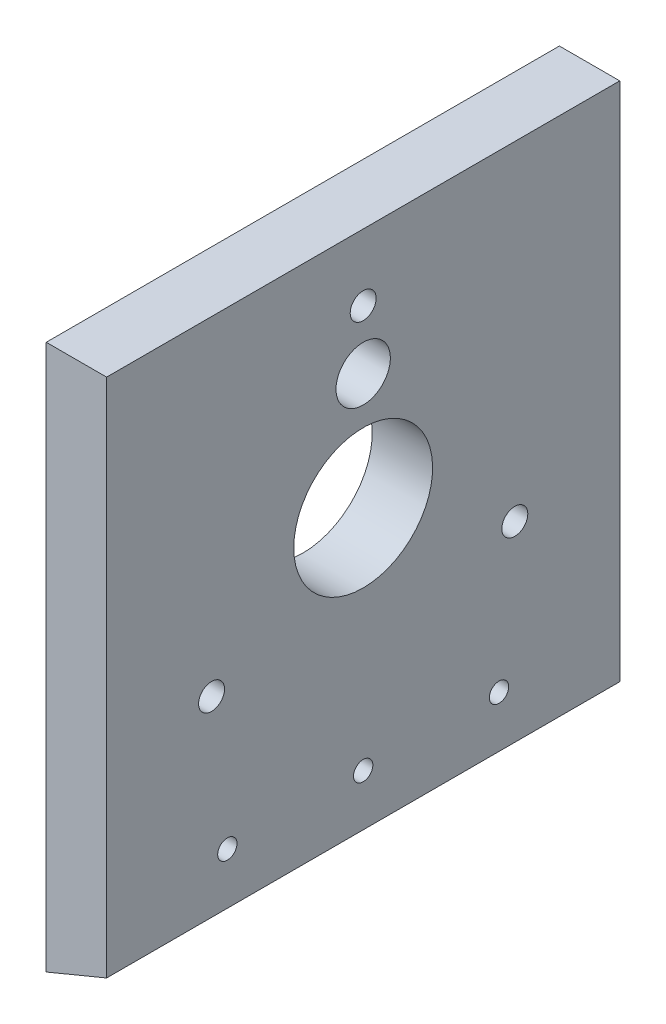
ISO-10303-21;
HEADER;
FILE_DESCRIPTION(('STEP AP214'),'2;1');
FILE_NAME('part.step','',(''),(''),'','','');
FILE_SCHEMA(('AUTOMOTIVE_DESIGN { 1 0 10303 214 1 1 1 1 }'));
ENDSEC;
DATA;
#1=APPLICATION_CONTEXT('core data for automotive mechanical design processes');
#2=APPLICATION_PROTOCOL_DEFINITION('international standard','automotive_design',2000,#1);
#3=PRODUCT_CONTEXT('',#1,'mechanical');
#4=PRODUCT('Part','Part','',(#3));
#5=PRODUCT_RELATED_PRODUCT_CATEGORY('part','',(#4));
#6=PRODUCT_DEFINITION_FORMATION('','',#4);
#7=PRODUCT_DEFINITION_CONTEXT('part definition',#1,'design');
#8=PRODUCT_DEFINITION('design','',#6,#7);
#9=PRODUCT_DEFINITION_SHAPE('','',#8);
#10=(LENGTH_UNIT() NAMED_UNIT(*) SI_UNIT(.MILLI.,.METRE.));
#11=(NAMED_UNIT(*) PLANE_ANGLE_UNIT() SI_UNIT($,.RADIAN.));
#12=(NAMED_UNIT(*) SI_UNIT($,.STERADIAN.) SOLID_ANGLE_UNIT());
#13=UNCERTAINTY_MEASURE_WITH_UNIT(LENGTH_MEASURE(1.E-05),#10,'distance_accuracy_value','');
#14=(GEOMETRIC_REPRESENTATION_CONTEXT(3) GLOBAL_UNCERTAINTY_ASSIGNED_CONTEXT((#13)) GLOBAL_UNIT_ASSIGNED_CONTEXT((#10,
#11,#12)) REPRESENTATION_CONTEXT('',''));
#15=CARTESIAN_POINT('',(0.,0.,0.));
#16=DIRECTION('',(0.,0.,1.));
#17=DIRECTION('',(1.,0.,0.));
#18=AXIS2_PLACEMENT_3D('',#15,#16,#17);
#19=CARTESIAN_POINT('',(-9.99999999999999,-4.14213562373092,85.));
#20=DIRECTION('',(-0.382683432365088,0.923879532511288,0.));
#21=DIRECTION('',(-0.923879532511288,-0.382683432365088,0.));
#22=AXIS2_PLACEMENT_3D('',#19,#20,#21);
#23=PLANE('',#22);
#24=DIRECTION('',(0.923879532511288,0.382683432365088,0.));
#25=VECTOR('',#24,1.);
#26=CARTESIAN_POINT('',(-9.99999999999999,-4.14213562373092,0.));
#27=LINE('',#26,#25);
#28=CARTESIAN_POINT('',(-9.99999999999999,-4.14213562373092,0.));
#29=VERTEX_POINT('',#28);
#30=CARTESIAN_POINT('',(0.,0.,0.));
#31=VERTEX_POINT('',#30);
#32=EDGE_CURVE('E116',#29,#31,#27,.T.);
#33=ORIENTED_EDGE('',*,*,#32,.T.);
#34=DIRECTION('',(0.,0.,-1.));
#35=VECTOR('',#34,1.);
#36=CARTESIAN_POINT('',(0.,0.,85.));
#37=LINE('',#36,#35);
#38=CARTESIAN_POINT('',(0.,0.,85.));
#39=VERTEX_POINT('',#38);
#40=EDGE_CURVE('E11',#39,#31,#37,.T.);
#41=ORIENTED_EDGE('',*,*,#40,.F.);
#42=DIRECTION('',(0.923879532511288,0.382683432365088,0.));
#43=VECTOR('',#42,1.);
#44=CARTESIAN_POINT('',(-9.99999999999999,-4.14213562373092,85.));
#45=LINE('',#44,#43);
#46=CARTESIAN_POINT('',(-9.99999999999999,-4.14213562373092,85.));
#47=VERTEX_POINT('',#46);
#48=EDGE_CURVE('E99',#47,#39,#45,.T.);
#49=ORIENTED_EDGE('',*,*,#48,.F.);
#50=DIRECTION('',(0.,0.,-1.));
#51=VECTOR('',#50,1.);
#52=CARTESIAN_POINT('',(-9.99999999999999,-4.14213562373092,85.));
#53=LINE('',#52,#51);
#54=EDGE_CURVE('E112',#47,#29,#53,.T.);
#55=ORIENTED_EDGE('',*,*,#54,.T.);
#56=EDGE_LOOP('',(#33,#41,#49,#55));
#57=FACE_BOUND('',#56,.T.);
#58=ADVANCED_FACE('F45',(#57),#23,.F.);
#59=CARTESIAN_POINT('',(0.,0.,85.));
#60=DIRECTION('',(-1.,0.,0.));
#61=DIRECTION('',(0.,0.,1.));
#62=AXIS2_PLACEMENT_3D('',#59,#60,#61);
#63=PLANE('',#62);
#64=CARTESIAN_POINT('',(0.,8.5,65.));
#65=DIRECTION('',(1.,0.,0.));
#66=DIRECTION('',(0.,0.,-1.));
#67=AXIS2_PLACEMENT_3D('',#64,#65,#66);
#68=CIRCLE('',#67,1.6);
#69=CARTESIAN_POINT('',(0.,8.5,63.4));
#70=VERTEX_POINT('',#69);
#71=EDGE_CURVE('E135',#70,#70,#68,.T.);
#72=ORIENTED_EDGE('',*,*,#71,.F.);
#73=EDGE_LOOP('',(#72));
#74=FACE_BOUND('',#73,.T.);
#75=CARTESIAN_POINT('',(0.,8.5,20.));
#76=DIRECTION('',(1.,0.,0.));
#77=DIRECTION('',(0.,0.,-1.));
#78=AXIS2_PLACEMENT_3D('',#75,#76,#77);
#79=CIRCLE('',#78,1.6);
#80=CARTESIAN_POINT('',(0.,8.5,18.4));
#81=VERTEX_POINT('',#80);
#82=EDGE_CURVE('E193',#81,#81,#79,.T.);
#83=ORIENTED_EDGE('',*,*,#82,.F.);
#84=EDGE_LOOP('',(#83));
#85=FACE_BOUND('',#84,.T.);
#86=CARTESIAN_POINT('',(0.,8.5,42.5));
#87=DIRECTION('',(1.,0.,0.));
#88=DIRECTION('',(0.,0.,-1.));
#89=AXIS2_PLACEMENT_3D('',#86,#87,#88);
#90=CIRCLE('',#89,1.6);
#91=CARTESIAN_POINT('',(0.,8.5,40.9));
#92=VERTEX_POINT('',#91);
#93=EDGE_CURVE('E189',#92,#92,#90,.T.);
#94=ORIENTED_EDGE('',*,*,#93,.F.);
#95=EDGE_LOOP('',(#94));
#96=FACE_BOUND('',#95,.T.);
#97=CARTESIAN_POINT('',(0.,31.6999999999995,17.3852632902524));
#98=DIRECTION('',(-1.,0.,0.));
#99=DIRECTION('',(0.,0.,1.));
#100=AXIS2_PLACEMENT_3D('',#97,#98,#99);
#101=CIRCLE('',#100,2.15000000000001);
#102=CARTESIAN_POINT('',(0.,31.6999999999995,19.5352632902524));
#103=VERTEX_POINT('',#102);
#104=EDGE_CURVE('E120',#103,#103,#101,.T.);
#105=ORIENTED_EDGE('',*,*,#104,.T.);
#106=EDGE_LOOP('',(#105));
#107=FACE_BOUND('',#106,.T.);
#108=CARTESIAN_POINT('',(0.,31.7000000000006,67.6147367097499));
#109=DIRECTION('',(-1.,0.,0.));
#110=DIRECTION('',(0.,0.,1.));
#111=AXIS2_PLACEMENT_3D('',#108,#109,#110);
#112=CIRCLE('',#111,2.15);
#113=CARTESIAN_POINT('',(0.,31.7000000000006,69.7647367097499));
#114=VERTEX_POINT('',#113);
#115=EDGE_CURVE('E174',#114,#114,#112,.T.);
#116=ORIENTED_EDGE('',*,*,#115,.T.);
#117=EDGE_LOOP('',(#116));
#118=FACE_BOUND('',#117,.T.);
#119=CARTESIAN_POINT('',(0.,75.2,42.5));
#120=DIRECTION('',(-1.,0.,0.));
#121=DIRECTION('',(0.,0.,1.));
#122=AXIS2_PLACEMENT_3D('',#119,#120,#121);
#123=CIRCLE('',#122,2.15);
#124=CARTESIAN_POINT('',(0.,75.2,44.65));
#125=VERTEX_POINT('',#124);
#126=EDGE_CURVE('E170',#125,#125,#123,.T.);
#127=ORIENTED_EDGE('',*,*,#126,.T.);
#128=EDGE_LOOP('',(#127));
#129=FACE_BOUND('',#128,.T.);
#130=CARTESIAN_POINT('',(0.,65.45,42.5));
#131=DIRECTION('',(-1.,0.,0.));
#132=DIRECTION('',(0.,0.,1.));
#133=AXIS2_PLACEMENT_3D('',#130,#131,#132);
#134=CIRCLE('',#133,4.5);
#135=CARTESIAN_POINT('',(0.,65.45,47.));
#136=VERTEX_POINT('',#135);
#137=EDGE_CURVE('E166',#136,#136,#134,.T.);
#138=ORIENTED_EDGE('',*,*,#137,.T.);
#139=EDGE_LOOP('',(#138));
#140=FACE_BOUND('',#139,.T.);
#141=CARTESIAN_POINT('',(0.,46.2,42.5));
#142=DIRECTION('',(-1.,0.,0.));
#143=DIRECTION('',(0.,0.,1.));
#144=AXIS2_PLACEMENT_3D('',#141,#142,#143);
#145=CIRCLE('',#144,11.5);
#146=CARTESIAN_POINT('',(0.,46.2,54.));
#147=VERTEX_POINT('',#146);
#148=EDGE_CURVE('E161',#147,#147,#145,.T.);
#149=ORIENTED_EDGE('',*,*,#148,.T.);
#150=EDGE_LOOP('',(#149));
#151=FACE_BOUND('',#150,.T.);
#152=DIRECTION('',(0.,1.,0.));
#153=VECTOR('',#152,1.);
#154=CARTESIAN_POINT('',(0.,0.,0.));
#155=LINE('',#154,#153);
#156=CARTESIAN_POINT('',(0.,86.2,0.));
#157=VERTEX_POINT('',#156);
#158=EDGE_CURVE('E104',#31,#157,#155,.T.);
#159=ORIENTED_EDGE('',*,*,#158,.T.);
#160=DIRECTION('',(0.,0.,-1.));
#161=VECTOR('',#160,1.);
#162=CARTESIAN_POINT('',(0.,86.2,85.));
#163=LINE('',#162,#161);
#164=CARTESIAN_POINT('',(0.,86.2,85.));
#165=VERTEX_POINT('',#164);
#166=EDGE_CURVE('E55',#165,#157,#163,.T.);
#167=ORIENTED_EDGE('',*,*,#166,.F.);
#168=DIRECTION('',(0.,1.,0.));
#169=VECTOR('',#168,1.);
#170=CARTESIAN_POINT('',(0.,0.,85.));
#171=LINE('',#170,#169);
#172=EDGE_CURVE('E94',#39,#165,#171,.T.);
#173=ORIENTED_EDGE('',*,*,#172,.F.);
#174=ORIENTED_EDGE('',*,*,#40,.T.);
#175=EDGE_LOOP('',(#159,#167,#173,#174));
#176=FACE_BOUND('',#175,.T.);
#177=ADVANCED_FACE('F103',(#74,#85,#96,#107,#118,#129,#140,#151,#176),#63,.F.);
#178=CARTESIAN_POINT('',(0.,86.2,85.));
#179=DIRECTION('',(0.,-1.,0.));
#180=DIRECTION('',(0.,0.,-1.));
#181=AXIS2_PLACEMENT_3D('',#178,#179,#180);
#182=PLANE('',#181);
#183=DIRECTION('',(-1.,0.,0.));
#184=VECTOR('',#183,1.);
#185=CARTESIAN_POINT('',(0.,86.2,0.));
#186=LINE('',#185,#184);
#187=CARTESIAN_POINT('',(-10.,86.2,0.));
#188=VERTEX_POINT('',#187);
#189=EDGE_CURVE('E81',#157,#188,#186,.T.);
#190=ORIENTED_EDGE('',*,*,#189,.T.);
#191=DIRECTION('',(0.,0.,-1.));
#192=VECTOR('',#191,1.);
#193=CARTESIAN_POINT('',(-10.,86.2,85.));
#194=LINE('',#193,#192);
#195=CARTESIAN_POINT('',(-10.,86.2,85.));
#196=VERTEX_POINT('',#195);
#197=EDGE_CURVE('E106',#196,#188,#194,.T.);
#198=ORIENTED_EDGE('',*,*,#197,.F.);
#199=DIRECTION('',(-1.,0.,0.));
#200=VECTOR('',#199,1.);
#201=CARTESIAN_POINT('',(0.,86.2,85.));
#202=LINE('',#201,#200);
#203=EDGE_CURVE('E97',#165,#196,#202,.T.);
#204=ORIENTED_EDGE('',*,*,#203,.F.);
#205=ORIENTED_EDGE('',*,*,#166,.T.);
#206=EDGE_LOOP('',(#190,#198,#204,#205));
#207=FACE_BOUND('',#206,.T.);
#208=ADVANCED_FACE('F108',(#207),#182,.F.);
#209=CARTESIAN_POINT('',(-10.,86.2,85.));
#210=DIRECTION('',(1.,0.,0.));
#211=DIRECTION('',(0.,1.,0.));
#212=AXIS2_PLACEMENT_3D('',#209,#210,#211);
#213=PLANE('',#212);
#214=CARTESIAN_POINT('',(-9.99999999999998,8.5,65.));
#215=DIRECTION('',(1.,0.,0.));
#216=DIRECTION('',(0.,1.,0.));
#217=AXIS2_PLACEMENT_3D('',#214,#215,#216);
#218=CIRCLE('',#217,1.6);
#219=CARTESIAN_POINT('',(-9.99999999999998,10.1,65.));
#220=VERTEX_POINT('',#219);
#221=EDGE_CURVE('E48',#220,#220,#218,.T.);
#222=ORIENTED_EDGE('',*,*,#221,.T.);
#223=EDGE_LOOP('',(#222));
#224=FACE_BOUND('',#223,.T.);
#225=CARTESIAN_POINT('',(-9.99999999999998,8.5,20.));
#226=DIRECTION('',(1.,0.,0.));
#227=DIRECTION('',(0.,1.,0.));
#228=AXIS2_PLACEMENT_3D('',#225,#226,#227);
#229=CIRCLE('',#228,1.6);
#230=CARTESIAN_POINT('',(-9.99999999999998,10.1,20.));
#231=VERTEX_POINT('',#230);
#232=EDGE_CURVE('E134',#231,#231,#229,.T.);
#233=ORIENTED_EDGE('',*,*,#232,.T.);
#234=EDGE_LOOP('',(#233));
#235=FACE_BOUND('',#234,.T.);
#236=CARTESIAN_POINT('',(-9.99999999999998,8.5,42.5));
#237=DIRECTION('',(1.,0.,0.));
#238=DIRECTION('',(0.,1.,0.));
#239=AXIS2_PLACEMENT_3D('',#236,#237,#238);
#240=CIRCLE('',#239,1.6);
#241=CARTESIAN_POINT('',(-9.99999999999998,10.1,42.5));
#242=VERTEX_POINT('',#241);
#243=EDGE_CURVE('E131',#242,#242,#240,.T.);
#244=ORIENTED_EDGE('',*,*,#243,.T.);
#245=EDGE_LOOP('',(#244));
#246=FACE_BOUND('',#245,.T.);
#247=CARTESIAN_POINT('',(-9.99999999999999,31.6999999999995,17.3852632902524));
#248=DIRECTION('',(-1.,0.,0.));
#249=DIRECTION('',(0.,-1.,0.));
#250=AXIS2_PLACEMENT_3D('',#247,#248,#249);
#251=CIRCLE('',#250,2.15000000000001);
#252=CARTESIAN_POINT('',(-9.99999999999999,29.5499999999995,17.3852632902524));
#253=VERTEX_POINT('',#252);
#254=EDGE_CURVE('E142',#253,#253,#251,.T.);
#255=ORIENTED_EDGE('',*,*,#254,.F.);
#256=EDGE_LOOP('',(#255));
#257=FACE_BOUND('',#256,.T.);
#258=CARTESIAN_POINT('',(-9.99999999999999,31.7000000000006,67.6147367097499));
#259=DIRECTION('',(-1.,0.,0.));
#260=DIRECTION('',(0.,-1.,0.));
#261=AXIS2_PLACEMENT_3D('',#258,#259,#260);
#262=CIRCLE('',#261,2.15);
#263=CARTESIAN_POINT('',(-9.99999999999999,29.5500000000006,67.6147367097499));
#264=VERTEX_POINT('',#263);
#265=EDGE_CURVE('E147',#264,#264,#262,.T.);
#266=ORIENTED_EDGE('',*,*,#265,.F.);
#267=EDGE_LOOP('',(#266));
#268=FACE_BOUND('',#267,.T.);
#269=CARTESIAN_POINT('',(-10.,75.2,42.5));
#270=DIRECTION('',(-1.,0.,0.));
#271=DIRECTION('',(0.,-1.,0.));
#272=AXIS2_PLACEMENT_3D('',#269,#270,#271);
#273=CIRCLE('',#272,2.15);
#274=CARTESIAN_POINT('',(-10.,73.05,42.5));
#275=VERTEX_POINT('',#274);
#276=EDGE_CURVE('E153',#275,#275,#273,.T.);
#277=ORIENTED_EDGE('',*,*,#276,.F.);
#278=EDGE_LOOP('',(#277));
#279=FACE_BOUND('',#278,.T.);
#280=CARTESIAN_POINT('',(-10.,65.45,42.5));
#281=DIRECTION('',(-1.,0.,0.));
#282=DIRECTION('',(0.,-1.,0.));
#283=AXIS2_PLACEMENT_3D('',#280,#281,#282);
#284=CIRCLE('',#283,4.5);
#285=CARTESIAN_POINT('',(-10.,60.95,42.5));
#286=VERTEX_POINT('',#285);
#287=EDGE_CURVE('E162',#286,#286,#284,.T.);
#288=ORIENTED_EDGE('',*,*,#287,.F.);
#289=EDGE_LOOP('',(#288));
#290=FACE_BOUND('',#289,.T.);
#291=CARTESIAN_POINT('',(-9.99999999999999,46.2,42.5));
#292=DIRECTION('',(-1.,0.,0.));
#293=DIRECTION('',(0.,-1.,0.));
#294=AXIS2_PLACEMENT_3D('',#291,#292,#293);
#295=CIRCLE('',#294,11.5);
#296=CARTESIAN_POINT('',(-9.99999999999999,34.7,42.5));
#297=VERTEX_POINT('',#296);
#298=EDGE_CURVE('E157',#297,#297,#295,.T.);
#299=ORIENTED_EDGE('',*,*,#298,.F.);
#300=EDGE_LOOP('',(#299));
#301=FACE_BOUND('',#300,.T.);
#302=DIRECTION('',(0.,-1.,0.));
#303=VECTOR('',#302,1.);
#304=CARTESIAN_POINT('',(-10.,86.2,0.));
#305=LINE('',#304,#303);
#306=EDGE_CURVE('E87',#188,#29,#305,.T.);
#307=ORIENTED_EDGE('',*,*,#306,.T.);
#308=ORIENTED_EDGE('',*,*,#54,.F.);
#309=DIRECTION('',(0.,-1.,0.));
#310=VECTOR('',#309,1.);
#311=CARTESIAN_POINT('',(-10.,86.2,85.));
#312=LINE('',#311,#310);
#313=EDGE_CURVE('E64',#196,#47,#312,.T.);
#314=ORIENTED_EDGE('',*,*,#313,.F.);
#315=ORIENTED_EDGE('',*,*,#197,.T.);
#316=EDGE_LOOP('',(#307,#308,#314,#315));
#317=FACE_BOUND('',#316,.T.);
#318=ADVANCED_FACE('F243',(#224,#235,#246,#257,#268,#279,#290,#301,#317),#213,.F.);
#319=CARTESIAN_POINT('',(0.,0.,85.));
#320=DIRECTION('',(0.,0.,1.));
#321=DIRECTION('',(1.,0.,0.));
#322=AXIS2_PLACEMENT_3D('',#319,#320,#321);
#323=PLANE('',#322);
#324=ORIENTED_EDGE('',*,*,#48,.T.);
#325=ORIENTED_EDGE('',*,*,#172,.T.);
#326=ORIENTED_EDGE('',*,*,#203,.T.);
#327=ORIENTED_EDGE('',*,*,#313,.T.);
#328=EDGE_LOOP('',(#324,#325,#326,#327));
#329=FACE_BOUND('',#328,.T.);
#330=ADVANCED_FACE('F95',(#329),#323,.T.);
#331=CARTESIAN_POINT('',(0.,0.,0.));
#332=DIRECTION('',(0.,0.,1.));
#333=DIRECTION('',(1.,0.,0.));
#334=AXIS2_PLACEMENT_3D('',#331,#332,#333);
#335=PLANE('',#334);
#336=ORIENTED_EDGE('',*,*,#32,.F.);
#337=ORIENTED_EDGE('',*,*,#306,.F.);
#338=ORIENTED_EDGE('',*,*,#189,.F.);
#339=ORIENTED_EDGE('',*,*,#158,.F.);
#340=EDGE_LOOP('',(#336,#337,#338,#339));
#341=FACE_BOUND('',#340,.T.);
#342=ADVANCED_FACE('F223',(#341),#335,.F.);
#343=CARTESIAN_POINT('',(75.,46.2,42.5));
#344=DIRECTION('',(-1.,0.,0.));
#345=DIRECTION('',(0.,-1.,0.));
#346=AXIS2_PLACEMENT_3D('',#343,#344,#345);
#347=CYLINDRICAL_SURFACE('',#346,11.5);
#348=ORIENTED_EDGE('',*,*,#298,.T.);
#349=EDGE_LOOP('',(#348));
#350=FACE_BOUND('',#349,.T.);
#351=ORIENTED_EDGE('',*,*,#148,.F.);
#352=EDGE_LOOP('',(#351));
#353=FACE_BOUND('',#352,.T.);
#354=ADVANCED_FACE('F220',(#350,#353),#347,.F.);
#355=CARTESIAN_POINT('',(75.,65.45,42.5));
#356=DIRECTION('',(-1.,0.,0.));
#357=DIRECTION('',(0.,-1.,0.));
#358=AXIS2_PLACEMENT_3D('',#355,#356,#357);
#359=CYLINDRICAL_SURFACE('',#358,4.5);
#360=ORIENTED_EDGE('',*,*,#287,.T.);
#361=EDGE_LOOP('',(#360));
#362=FACE_BOUND('',#361,.T.);
#363=ORIENTED_EDGE('',*,*,#137,.F.);
#364=EDGE_LOOP('',(#363));
#365=FACE_BOUND('',#364,.T.);
#366=ADVANCED_FACE('F222',(#362,#365),#359,.F.);
#367=CARTESIAN_POINT('',(75.,75.2,42.5));
#368=DIRECTION('',(-1.,0.,0.));
#369=DIRECTION('',(0.,-1.,0.));
#370=AXIS2_PLACEMENT_3D('',#367,#368,#369);
#371=CYLINDRICAL_SURFACE('',#370,2.15);
#372=ORIENTED_EDGE('',*,*,#276,.T.);
#373=EDGE_LOOP('',(#372));
#374=FACE_BOUND('',#373,.T.);
#375=ORIENTED_EDGE('',*,*,#126,.F.);
#376=EDGE_LOOP('',(#375));
#377=FACE_BOUND('',#376,.T.);
#378=ADVANCED_FACE('F230',(#374,#377),#371,.F.);
#379=CARTESIAN_POINT('',(75.,31.7000000000006,67.6147367097499));
#380=DIRECTION('',(-1.,0.,0.));
#381=DIRECTION('',(0.,-1.,0.));
#382=AXIS2_PLACEMENT_3D('',#379,#380,#381);
#383=CYLINDRICAL_SURFACE('',#382,2.15);
#384=ORIENTED_EDGE('',*,*,#265,.T.);
#385=EDGE_LOOP('',(#384));
#386=FACE_BOUND('',#385,.T.);
#387=ORIENTED_EDGE('',*,*,#115,.F.);
#388=EDGE_LOOP('',(#387));
#389=FACE_BOUND('',#388,.T.);
#390=ADVANCED_FACE('F263',(#386,#389),#383,.F.);
#391=CARTESIAN_POINT('',(75.,31.6999999999995,17.3852632902524));
#392=DIRECTION('',(-1.,0.,0.));
#393=DIRECTION('',(0.,-1.,0.));
#394=AXIS2_PLACEMENT_3D('',#391,#392,#393);
#395=CYLINDRICAL_SURFACE('',#394,2.15000000000001);
#396=ORIENTED_EDGE('',*,*,#254,.T.);
#397=EDGE_LOOP('',(#396));
#398=FACE_BOUND('',#397,.T.);
#399=ORIENTED_EDGE('',*,*,#104,.F.);
#400=EDGE_LOOP('',(#399));
#401=FACE_BOUND('',#400,.T.);
#402=ADVANCED_FACE('F266',(#398,#401),#395,.F.);
#403=CARTESIAN_POINT('',(-85.,8.5,42.5));
#404=DIRECTION('',(1.,0.,0.));
#405=DIRECTION('',(0.,0.,-1.));
#406=AXIS2_PLACEMENT_3D('',#403,#404,#405);
#407=CYLINDRICAL_SURFACE('',#406,1.6);
#408=ORIENTED_EDGE('',*,*,#93,.T.);
#409=EDGE_LOOP('',(#408));
#410=FACE_BOUND('',#409,.T.);
#411=ORIENTED_EDGE('',*,*,#243,.F.);
#412=EDGE_LOOP('',(#411));
#413=FACE_BOUND('',#412,.T.);
#414=ADVANCED_FACE('F272',(#410,#413),#407,.F.);
#415=CARTESIAN_POINT('',(-85.,8.5,20.));
#416=DIRECTION('',(1.,0.,0.));
#417=DIRECTION('',(0.,0.,-1.));
#418=AXIS2_PLACEMENT_3D('',#415,#416,#417);
#419=CYLINDRICAL_SURFACE('',#418,1.6);
#420=ORIENTED_EDGE('',*,*,#82,.T.);
#421=EDGE_LOOP('',(#420));
#422=FACE_BOUND('',#421,.T.);
#423=ORIENTED_EDGE('',*,*,#232,.F.);
#424=EDGE_LOOP('',(#423));
#425=FACE_BOUND('',#424,.T.);
#426=ADVANCED_FACE('F276',(#422,#425),#419,.F.);
#427=CARTESIAN_POINT('',(-85.,8.5,65.));
#428=DIRECTION('',(1.,0.,0.));
#429=DIRECTION('',(0.,0.,-1.));
#430=AXIS2_PLACEMENT_3D('',#427,#428,#429);
#431=CYLINDRICAL_SURFACE('',#430,1.6);
#432=ORIENTED_EDGE('',*,*,#71,.T.);
#433=EDGE_LOOP('',(#432));
#434=FACE_BOUND('',#433,.T.);
#435=ORIENTED_EDGE('',*,*,#221,.F.);
#436=EDGE_LOOP('',(#435));
#437=FACE_BOUND('',#436,.T.);
#438=ADVANCED_FACE('F201',(#434,#437),#431,.F.);
#439=CLOSED_SHELL('',(#58,#177,#208,#318,#330,#342,#354,#366,#378,#390,#402,#414,#426,#438));
#440=MANIFOLD_SOLID_BREP('B2',#439);
#441=ADVANCED_BREP_SHAPE_REPRESENTATION('',(#18,#440),#14);
#442=SHAPE_DEFINITION_REPRESENTATION(#9,#441);
ENDSEC;
END-ISO-10303-21;
